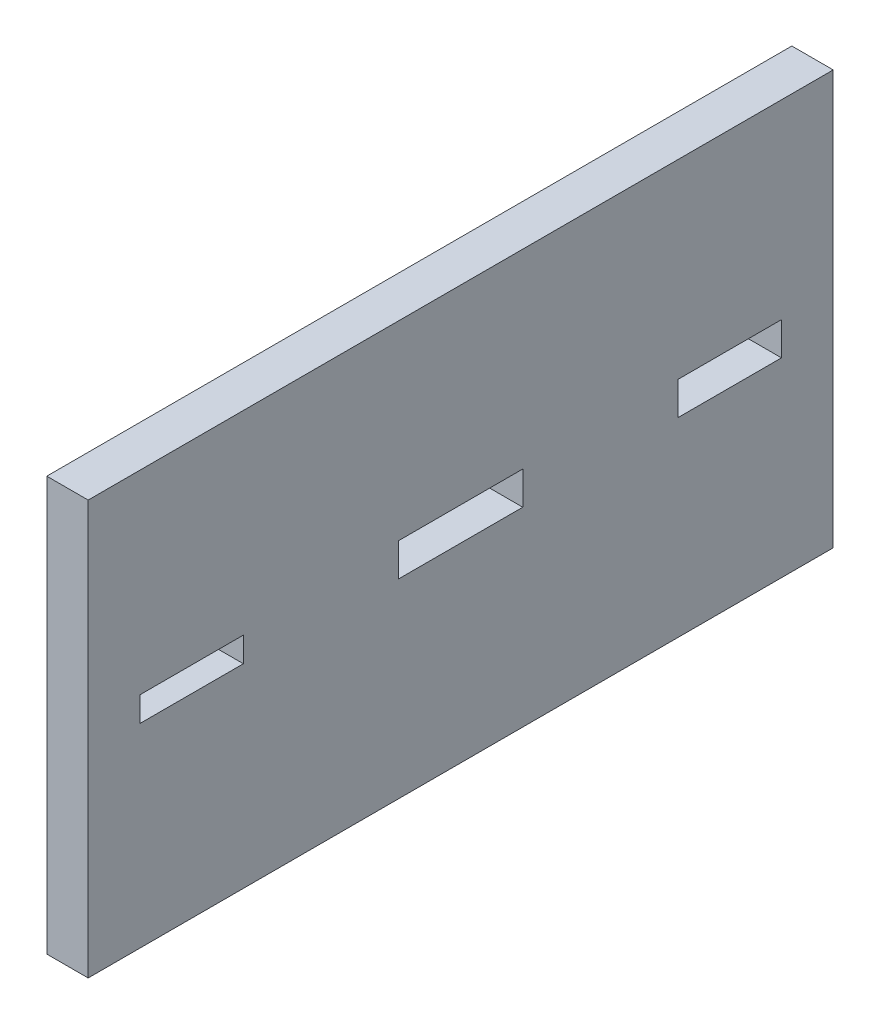
ISO-10303-21;
HEADER;
FILE_DESCRIPTION(('STEP AP214'),'2;1');
FILE_NAME('part.step','',(''),(''),'','','');
FILE_SCHEMA(('AUTOMOTIVE_DESIGN { 1 0 10303 214 1 1 1 1 }'));
ENDSEC;
DATA;
#1=APPLICATION_CONTEXT('core data for automotive mechanical design processes');
#2=APPLICATION_PROTOCOL_DEFINITION('international standard','automotive_design',2000,#1);
#3=PRODUCT_CONTEXT('',#1,'mechanical');
#4=PRODUCT('Part','Part','',(#3));
#5=PRODUCT_RELATED_PRODUCT_CATEGORY('part','',(#4));
#6=PRODUCT_DEFINITION_FORMATION('','',#4);
#7=PRODUCT_DEFINITION_CONTEXT('part definition',#1,'design');
#8=PRODUCT_DEFINITION('design','',#6,#7);
#9=PRODUCT_DEFINITION_SHAPE('','',#8);
#10=(LENGTH_UNIT() NAMED_UNIT(*) SI_UNIT(.MILLI.,.METRE.));
#11=(NAMED_UNIT(*) PLANE_ANGLE_UNIT() SI_UNIT($,.RADIAN.));
#12=(NAMED_UNIT(*) SI_UNIT($,.STERADIAN.) SOLID_ANGLE_UNIT());
#13=UNCERTAINTY_MEASURE_WITH_UNIT(LENGTH_MEASURE(1.E-05),#10,'distance_accuracy_value','');
#14=(GEOMETRIC_REPRESENTATION_CONTEXT(3) GLOBAL_UNCERTAINTY_ASSIGNED_CONTEXT((#13)) GLOBAL_UNIT_ASSIGNED_CONTEXT((#10,
#11,#12)) REPRESENTATION_CONTEXT('',''));
#15=CARTESIAN_POINT('',(0.,0.,0.));
#16=DIRECTION('',(0.,0.,1.));
#17=DIRECTION('',(1.,0.,0.));
#18=AXIS2_PLACEMENT_3D('',#15,#16,#17);
#19=CARTESIAN_POINT('',(10.,0.,0.));
#20=DIRECTION('',(1.,0.,0.));
#21=DIRECTION('',(0.,0.,-1.));
#22=AXIS2_PLACEMENT_3D('',#19,#20,#21);
#23=PLANE('',#22);
#24=DIRECTION('',(0.,-1.,0.));
#25=VECTOR('',#24,1.);
#26=CARTESIAN_POINT('',(10.,50.,90.));
#27=LINE('',#26,#25);
#28=CARTESIAN_POINT('',(10.,50.,90.));
#29=VERTEX_POINT('',#28);
#30=CARTESIAN_POINT('',(10.,-50.,90.));
#31=VERTEX_POINT('',#30);
#32=EDGE_CURVE('E287',#29,#31,#27,.T.);
#33=ORIENTED_EDGE('',*,*,#32,.T.);
#34=DIRECTION('',(0.,0.,-1.));
#35=VECTOR('',#34,1.);
#36=CARTESIAN_POINT('',(10.,-50.,90.));
#37=LINE('',#36,#35);
#38=CARTESIAN_POINT('',(10.,-50.,-90.));
#39=VERTEX_POINT('',#38);
#40=EDGE_CURVE('E291',#31,#39,#37,.T.);
#41=ORIENTED_EDGE('',*,*,#40,.T.);
#42=DIRECTION('',(0.,1.,0.));
#43=VECTOR('',#42,1.);
#44=CARTESIAN_POINT('',(10.,50.,-90.));
#45=LINE('',#44,#43);
#46=CARTESIAN_POINT('',(10.,50.,-90.));
#47=VERTEX_POINT('',#46);
#48=EDGE_CURVE('E295',#39,#47,#45,.T.);
#49=ORIENTED_EDGE('',*,*,#48,.T.);
#50=DIRECTION('',(0.,0.,1.));
#51=VECTOR('',#50,1.);
#52=CARTESIAN_POINT('',(10.,50.,90.));
#53=LINE('',#52,#51);
#54=EDGE_CURVE('E298',#47,#29,#53,.T.);
#55=ORIENTED_EDGE('',*,*,#54,.T.);
#56=EDGE_LOOP('',(#33,#41,#49,#55));
#57=FACE_BOUND('',#56,.T.);
#58=DIRECTION('',(0.,0.,-1.));
#59=VECTOR('',#58,1.);
#60=CARTESIAN_POINT('',(10.,-4.,15.));
#61=LINE('',#60,#59);
#62=CARTESIAN_POINT('',(10.,-4.,15.));
#63=VERTEX_POINT('',#62);
#64=CARTESIAN_POINT('',(10.,-4.00000000000001,-15.));
#65=VERTEX_POINT('',#64);
#66=EDGE_CURVE('E247',#63,#65,#61,.T.);
#67=ORIENTED_EDGE('',*,*,#66,.F.);
#68=DIRECTION('',(0.,-1.,0.));
#69=VECTOR('',#68,1.);
#70=CARTESIAN_POINT('',(10.,4.,15.));
#71=LINE('',#70,#69);
#72=CARTESIAN_POINT('',(10.,4.,15.));
#73=VERTEX_POINT('',#72);
#74=EDGE_CURVE('E244',#73,#63,#71,.T.);
#75=ORIENTED_EDGE('',*,*,#74,.F.);
#76=DIRECTION('',(0.,0.,1.));
#77=VECTOR('',#76,1.);
#78=CARTESIAN_POINT('',(10.,4.,15.));
#79=LINE('',#78,#77);
#80=CARTESIAN_POINT('',(10.,4.00000000000001,-15.));
#81=VERTEX_POINT('',#80);
#82=EDGE_CURVE('E255',#81,#73,#79,.T.);
#83=ORIENTED_EDGE('',*,*,#82,.F.);
#84=DIRECTION('',(0.,1.,0.));
#85=VECTOR('',#84,1.);
#86=CARTESIAN_POINT('',(10.,4.00000000000001,-15.));
#87=LINE('',#86,#85);
#88=EDGE_CURVE('E251',#65,#81,#87,.T.);
#89=ORIENTED_EDGE('',*,*,#88,.F.);
#90=EDGE_LOOP('',(#67,#75,#83,#89));
#91=FACE_BOUND('',#90,.T.);
#92=DIRECTION('',(0.,0.,-1.));
#93=VECTOR('',#92,1.);
#94=CARTESIAN_POINT('',(10.,-3.00000000000001,77.5));
#95=LINE('',#94,#93);
#96=CARTESIAN_POINT('',(10.,-3.00000000000001,77.5));
#97=VERTEX_POINT('',#96);
#98=CARTESIAN_POINT('',(10.,-3.00000000000001,52.5));
#99=VERTEX_POINT('',#98);
#100=EDGE_CURVE('E204',#97,#99,#95,.T.);
#101=ORIENTED_EDGE('',*,*,#100,.F.);
#102=DIRECTION('',(0.,-1.,0.));
#103=VECTOR('',#102,1.);
#104=CARTESIAN_POINT('',(10.,2.99999999999999,77.5));
#105=LINE('',#104,#103);
#106=CARTESIAN_POINT('',(10.,2.99999999999999,77.5));
#107=VERTEX_POINT('',#106);
#108=EDGE_CURVE('E201',#107,#97,#105,.T.);
#109=ORIENTED_EDGE('',*,*,#108,.F.);
#110=DIRECTION('',(0.,0.,1.));
#111=VECTOR('',#110,1.);
#112=CARTESIAN_POINT('',(10.,2.99999999999999,77.5));
#113=LINE('',#112,#111);
#114=CARTESIAN_POINT('',(10.,2.99999999999999,52.5));
#115=VERTEX_POINT('',#114);
#116=EDGE_CURVE('E212',#115,#107,#113,.T.);
#117=ORIENTED_EDGE('',*,*,#116,.F.);
#118=DIRECTION('',(0.,1.,0.));
#119=VECTOR('',#118,1.);
#120=CARTESIAN_POINT('',(10.,2.99999999999999,52.5));
#121=LINE('',#120,#119);
#122=EDGE_CURVE('E208',#99,#115,#121,.T.);
#123=ORIENTED_EDGE('',*,*,#122,.F.);
#124=EDGE_LOOP('',(#101,#109,#117,#123));
#125=FACE_BOUND('',#124,.T.);
#126=DIRECTION('',(0.,0.,-1.));
#127=VECTOR('',#126,1.);
#128=CARTESIAN_POINT('',(10.,-3.99999999999999,-52.5));
#129=LINE('',#128,#127);
#130=CARTESIAN_POINT('',(10.,-3.99999999999999,-52.5));
#131=VERTEX_POINT('',#130);
#132=CARTESIAN_POINT('',(10.,-4.,-77.5));
#133=VERTEX_POINT('',#132);
#134=EDGE_CURVE('E162',#131,#133,#129,.T.);
#135=ORIENTED_EDGE('',*,*,#134,.F.);
#136=DIRECTION('',(0.,-1.,0.));
#137=VECTOR('',#136,1.);
#138=CARTESIAN_POINT('',(10.,3.99999999999999,-52.5));
#139=LINE('',#138,#137);
#140=CARTESIAN_POINT('',(10.,3.99999999999999,-52.5));
#141=VERTEX_POINT('',#140);
#142=EDGE_CURVE('E153',#141,#131,#139,.T.);
#143=ORIENTED_EDGE('',*,*,#142,.F.);
#144=DIRECTION('',(0.,0.,1.));
#145=VECTOR('',#144,1.);
#146=CARTESIAN_POINT('',(10.,3.99999999999999,-52.5));
#147=LINE('',#146,#145);
#148=CARTESIAN_POINT('',(10.,4.,-77.5));
#149=VERTEX_POINT('',#148);
#150=EDGE_CURVE('E179',#149,#141,#147,.T.);
#151=ORIENTED_EDGE('',*,*,#150,.F.);
#152=DIRECTION('',(0.,1.,0.));
#153=VECTOR('',#152,1.);
#154=CARTESIAN_POINT('',(10.,4.,-77.5));
#155=LINE('',#154,#153);
#156=EDGE_CURVE('E175',#133,#149,#155,.T.);
#157=ORIENTED_EDGE('',*,*,#156,.F.);
#158=EDGE_LOOP('',(#135,#143,#151,#157));
#159=FACE_BOUND('',#158,.T.);
#160=ADVANCED_FACE('F39',(#57,#91,#125,#159),#23,.T.);
#161=CARTESIAN_POINT('',(0.,0.,0.));
#162=DIRECTION('',(1.,0.,0.));
#163=DIRECTION('',(0.,0.,-1.));
#164=AXIS2_PLACEMENT_3D('',#161,#162,#163);
#165=PLANE('',#164);
#166=DIRECTION('',(0.,-1.,0.));
#167=VECTOR('',#166,1.);
#168=CARTESIAN_POINT('',(0.,2.99999999999999,77.5));
#169=LINE('',#168,#167);
#170=CARTESIAN_POINT('',(0.,2.99999999999999,77.5));
#171=VERTEX_POINT('',#170);
#172=CARTESIAN_POINT('',(0.,-3.00000000000001,77.5));
#173=VERTEX_POINT('',#172);
#174=EDGE_CURVE('E171',#171,#173,#169,.T.);
#175=ORIENTED_EDGE('',*,*,#174,.T.);
#176=DIRECTION('',(0.,0.,-1.));
#177=VECTOR('',#176,1.);
#178=CARTESIAN_POINT('',(0.,-3.00000000000001,77.5));
#179=LINE('',#178,#177);
#180=CARTESIAN_POINT('',(0.,-3.00000000000001,52.5));
#181=VERTEX_POINT('',#180);
#182=EDGE_CURVE('E219',#173,#181,#179,.T.);
#183=ORIENTED_EDGE('',*,*,#182,.T.);
#184=DIRECTION('',(0.,1.,0.));
#185=VECTOR('',#184,1.);
#186=CARTESIAN_POINT('',(0.,2.99999999999999,52.5));
#187=LINE('',#186,#185);
#188=CARTESIAN_POINT('',(0.,2.99999999999999,52.5));
#189=VERTEX_POINT('',#188);
#190=EDGE_CURVE('E223',#181,#189,#187,.T.);
#191=ORIENTED_EDGE('',*,*,#190,.T.);
#192=DIRECTION('',(0.,0.,1.));
#193=VECTOR('',#192,1.);
#194=CARTESIAN_POINT('',(0.,2.99999999999999,77.5));
#195=LINE('',#194,#193);
#196=EDGE_CURVE('E205',#189,#171,#195,.T.);
#197=ORIENTED_EDGE('',*,*,#196,.T.);
#198=EDGE_LOOP('',(#175,#183,#191,#197));
#199=FACE_BOUND('',#198,.T.);
#200=DIRECTION('',(0.,-1.,0.));
#201=VECTOR('',#200,1.);
#202=CARTESIAN_POINT('',(0.,50.,90.));
#203=LINE('',#202,#201);
#204=CARTESIAN_POINT('',(0.,50.,90.));
#205=VERTEX_POINT('',#204);
#206=CARTESIAN_POINT('',(0.,-50.,90.));
#207=VERTEX_POINT('',#206);
#208=EDGE_CURVE('E286',#205,#207,#203,.T.);
#209=ORIENTED_EDGE('',*,*,#208,.F.);
#210=DIRECTION('',(0.,0.,1.));
#211=VECTOR('',#210,1.);
#212=CARTESIAN_POINT('',(0.,50.,90.));
#213=LINE('',#212,#211);
#214=CARTESIAN_POINT('',(0.,50.,-90.));
#215=VERTEX_POINT('',#214);
#216=EDGE_CURVE('E292',#215,#205,#213,.T.);
#217=ORIENTED_EDGE('',*,*,#216,.F.);
#218=DIRECTION('',(0.,1.,0.));
#219=VECTOR('',#218,1.);
#220=CARTESIAN_POINT('',(0.,50.,-90.));
#221=LINE('',#220,#219);
#222=CARTESIAN_POINT('',(0.,-50.,-90.));
#223=VERTEX_POINT('',#222);
#224=EDGE_CURVE('E308',#223,#215,#221,.T.);
#225=ORIENTED_EDGE('',*,*,#224,.F.);
#226=DIRECTION('',(0.,0.,-1.));
#227=VECTOR('',#226,1.);
#228=CARTESIAN_POINT('',(0.,-50.,90.));
#229=LINE('',#228,#227);
#230=EDGE_CURVE('E305',#207,#223,#229,.T.);
#231=ORIENTED_EDGE('',*,*,#230,.F.);
#232=EDGE_LOOP('',(#209,#217,#225,#231));
#233=FACE_BOUND('',#232,.T.);
#234=DIRECTION('',(0.,-1.,0.));
#235=VECTOR('',#234,1.);
#236=CARTESIAN_POINT('',(0.,4.,15.));
#237=LINE('',#236,#235);
#238=CARTESIAN_POINT('',(0.,4.,15.));
#239=VERTEX_POINT('',#238);
#240=CARTESIAN_POINT('',(0.,-4.,15.));
#241=VERTEX_POINT('',#240);
#242=EDGE_CURVE('E243',#239,#241,#237,.T.);
#243=ORIENTED_EDGE('',*,*,#242,.T.);
#244=DIRECTION('',(0.,0.,-1.));
#245=VECTOR('',#244,1.);
#246=CARTESIAN_POINT('',(0.,-4.,15.));
#247=LINE('',#246,#245);
#248=CARTESIAN_POINT('',(0.,-4.00000000000001,-15.));
#249=VERTEX_POINT('',#248);
#250=EDGE_CURVE('E262',#241,#249,#247,.T.);
#251=ORIENTED_EDGE('',*,*,#250,.T.);
#252=DIRECTION('',(0.,1.,0.));
#253=VECTOR('',#252,1.);
#254=CARTESIAN_POINT('',(0.,4.00000000000001,-15.));
#255=LINE('',#254,#253);
#256=CARTESIAN_POINT('',(0.,4.00000000000001,-15.));
#257=VERTEX_POINT('',#256);
#258=EDGE_CURVE('E266',#249,#257,#255,.T.);
#259=ORIENTED_EDGE('',*,*,#258,.T.);
#260=DIRECTION('',(0.,0.,1.));
#261=VECTOR('',#260,1.);
#262=CARTESIAN_POINT('',(0.,4.,15.));
#263=LINE('',#262,#261);
#264=EDGE_CURVE('E248',#257,#239,#263,.T.);
#265=ORIENTED_EDGE('',*,*,#264,.T.);
#266=EDGE_LOOP('',(#243,#251,#259,#265));
#267=FACE_BOUND('',#266,.T.);
#268=DIRECTION('',(0.,-1.,0.));
#269=VECTOR('',#268,1.);
#270=CARTESIAN_POINT('',(0.,3.99999999999999,-52.5));
#271=LINE('',#270,#269);
#272=CARTESIAN_POINT('',(0.,3.99999999999999,-52.5));
#273=VERTEX_POINT('',#272);
#274=CARTESIAN_POINT('',(0.,-3.99999999999999,-52.5));
#275=VERTEX_POINT('',#274);
#276=EDGE_CURVE('E63',#273,#275,#271,.T.);
#277=ORIENTED_EDGE('',*,*,#276,.T.);
#278=DIRECTION('',(0.,0.,-1.));
#279=VECTOR('',#278,1.);
#280=CARTESIAN_POINT('',(0.,-3.99999999999999,-52.5));
#281=LINE('',#280,#279);
#282=CARTESIAN_POINT('',(0.,-4.,-77.5));
#283=VERTEX_POINT('',#282);
#284=EDGE_CURVE('E169',#275,#283,#281,.T.);
#285=ORIENTED_EDGE('',*,*,#284,.T.);
#286=DIRECTION('',(0.,1.,0.));
#287=VECTOR('',#286,1.);
#288=CARTESIAN_POINT('',(0.,4.,-77.5));
#289=LINE('',#288,#287);
#290=CARTESIAN_POINT('',(0.,4.,-77.5));
#291=VERTEX_POINT('',#290);
#292=EDGE_CURVE('E188',#283,#291,#289,.T.);
#293=ORIENTED_EDGE('',*,*,#292,.T.);
#294=DIRECTION('',(0.,0.,1.));
#295=VECTOR('',#294,1.);
#296=CARTESIAN_POINT('',(0.,3.99999999999999,-52.5));
#297=LINE('',#296,#295);
#298=EDGE_CURVE('E163',#291,#273,#297,.T.);
#299=ORIENTED_EDGE('',*,*,#298,.T.);
#300=EDGE_LOOP('',(#277,#285,#293,#299));
#301=FACE_BOUND('',#300,.T.);
#302=ADVANCED_FACE('F331',(#199,#233,#267,#301),#165,.F.);
#303=CARTESIAN_POINT('',(10.,50.,90.));
#304=DIRECTION('',(0.,0.,-1.));
#305=DIRECTION('',(-1.,0.,0.));
#306=AXIS2_PLACEMENT_3D('',#303,#304,#305);
#307=PLANE('',#306);
#308=ORIENTED_EDGE('',*,*,#208,.T.);
#309=DIRECTION('',(-1.,0.,0.));
#310=VECTOR('',#309,1.);
#311=CARTESIAN_POINT('',(10.,-50.,90.));
#312=LINE('',#311,#310);
#313=EDGE_CURVE('E11',#31,#207,#312,.T.);
#314=ORIENTED_EDGE('',*,*,#313,.F.);
#315=ORIENTED_EDGE('',*,*,#32,.F.);
#316=DIRECTION('',(-1.,0.,0.));
#317=VECTOR('',#316,1.);
#318=CARTESIAN_POINT('',(10.,50.,90.));
#319=LINE('',#318,#317);
#320=EDGE_CURVE('E301',#29,#205,#319,.T.);
#321=ORIENTED_EDGE('',*,*,#320,.T.);
#322=EDGE_LOOP('',(#308,#314,#315,#321));
#323=FACE_BOUND('',#322,.T.);
#324=ADVANCED_FACE('F41',(#323),#307,.F.);
#325=CARTESIAN_POINT('',(10.,-50.,90.));
#326=DIRECTION('',(0.,1.,0.));
#327=DIRECTION('',(0.,0.,1.));
#328=AXIS2_PLACEMENT_3D('',#325,#326,#327);
#329=PLANE('',#328);
#330=ORIENTED_EDGE('',*,*,#230,.T.);
#331=DIRECTION('',(-1.,0.,0.));
#332=VECTOR('',#331,1.);
#333=CARTESIAN_POINT('',(10.,-50.,-90.));
#334=LINE('',#333,#332);
#335=EDGE_CURVE('E48',#39,#223,#334,.T.);
#336=ORIENTED_EDGE('',*,*,#335,.F.);
#337=ORIENTED_EDGE('',*,*,#40,.F.);
#338=ORIENTED_EDGE('',*,*,#313,.T.);
#339=EDGE_LOOP('',(#330,#336,#337,#338));
#340=FACE_BOUND('',#339,.T.);
#341=ADVANCED_FACE('F342',(#340),#329,.F.);
#342=CARTESIAN_POINT('',(10.,50.,-90.));
#343=DIRECTION('',(0.,0.,1.));
#344=DIRECTION('',(1.,0.,0.));
#345=AXIS2_PLACEMENT_3D('',#342,#343,#344);
#346=PLANE('',#345);
#347=ORIENTED_EDGE('',*,*,#224,.T.);
#348=DIRECTION('',(-1.,0.,0.));
#349=VECTOR('',#348,1.);
#350=CARTESIAN_POINT('',(10.,50.,-90.));
#351=LINE('',#350,#349);
#352=EDGE_CURVE('E316',#47,#215,#351,.T.);
#353=ORIENTED_EDGE('',*,*,#352,.F.);
#354=ORIENTED_EDGE('',*,*,#48,.F.);
#355=ORIENTED_EDGE('',*,*,#335,.T.);
#356=EDGE_LOOP('',(#347,#353,#354,#355));
#357=FACE_BOUND('',#356,.T.);
#358=ADVANCED_FACE('F325',(#357),#346,.F.);
#359=CARTESIAN_POINT('',(10.,50.,90.));
#360=DIRECTION('',(0.,-1.,0.));
#361=DIRECTION('',(0.,0.,-1.));
#362=AXIS2_PLACEMENT_3D('',#359,#360,#361);
#363=PLANE('',#362);
#364=ORIENTED_EDGE('',*,*,#216,.T.);
#365=ORIENTED_EDGE('',*,*,#320,.F.);
#366=ORIENTED_EDGE('',*,*,#54,.F.);
#367=ORIENTED_EDGE('',*,*,#352,.T.);
#368=EDGE_LOOP('',(#364,#365,#366,#367));
#369=FACE_BOUND('',#368,.T.);
#370=ADVANCED_FACE('F335',(#369),#363,.F.);
#371=CARTESIAN_POINT('',(10.,4.,15.));
#372=DIRECTION('',(0.,0.,-1.));
#373=DIRECTION('',(-1.,0.,0.));
#374=AXIS2_PLACEMENT_3D('',#371,#372,#373);
#375=PLANE('',#374);
#376=ORIENTED_EDGE('',*,*,#242,.F.);
#377=DIRECTION('',(-1.,0.,0.));
#378=VECTOR('',#377,1.);
#379=CARTESIAN_POINT('',(10.,4.,15.));
#380=LINE('',#379,#378);
#381=EDGE_CURVE('E258',#73,#239,#380,.T.);
#382=ORIENTED_EDGE('',*,*,#381,.F.);
#383=ORIENTED_EDGE('',*,*,#74,.T.);
#384=DIRECTION('',(-1.,0.,0.));
#385=VECTOR('',#384,1.);
#386=CARTESIAN_POINT('',(10.,-4.,15.));
#387=LINE('',#386,#385);
#388=EDGE_CURVE('E282',#63,#241,#387,.T.);
#389=ORIENTED_EDGE('',*,*,#388,.T.);
#390=EDGE_LOOP('',(#376,#382,#383,#389));
#391=FACE_BOUND('',#390,.T.);
#392=ADVANCED_FACE('F357',(#391),#375,.T.);
#393=CARTESIAN_POINT('',(10.,-4.,15.));
#394=DIRECTION('',(0.,1.,0.));
#395=DIRECTION('',(0.,0.,1.));
#396=AXIS2_PLACEMENT_3D('',#393,#394,#395);
#397=PLANE('',#396);
#398=ORIENTED_EDGE('',*,*,#250,.F.);
#399=ORIENTED_EDGE('',*,*,#388,.F.);
#400=ORIENTED_EDGE('',*,*,#66,.T.);
#401=DIRECTION('',(-1.,0.,0.));
#402=VECTOR('',#401,1.);
#403=CARTESIAN_POINT('',(10.,-4.00000000000001,-15.));
#404=LINE('',#403,#402);
#405=EDGE_CURVE('E279',#65,#249,#404,.T.);
#406=ORIENTED_EDGE('',*,*,#405,.T.);
#407=EDGE_LOOP('',(#398,#399,#400,#406));
#408=FACE_BOUND('',#407,.T.);
#409=ADVANCED_FACE('F364',(#408),#397,.T.);
#410=CARTESIAN_POINT('',(10.,4.00000000000001,-15.));
#411=DIRECTION('',(0.,0.,1.));
#412=DIRECTION('',(1.,0.,0.));
#413=AXIS2_PLACEMENT_3D('',#410,#411,#412);
#414=PLANE('',#413);
#415=ORIENTED_EDGE('',*,*,#258,.F.);
#416=ORIENTED_EDGE('',*,*,#405,.F.);
#417=ORIENTED_EDGE('',*,*,#88,.T.);
#418=DIRECTION('',(-1.,0.,0.));
#419=VECTOR('',#418,1.);
#420=CARTESIAN_POINT('',(10.,4.00000000000001,-15.));
#421=LINE('',#420,#419);
#422=EDGE_CURVE('E276',#81,#257,#421,.T.);
#423=ORIENTED_EDGE('',*,*,#422,.T.);
#424=EDGE_LOOP('',(#415,#416,#417,#423));
#425=FACE_BOUND('',#424,.T.);
#426=ADVANCED_FACE('F369',(#425),#414,.T.);
#427=CARTESIAN_POINT('',(10.,4.,15.));
#428=DIRECTION('',(0.,-1.,0.));
#429=DIRECTION('',(0.,0.,-1.));
#430=AXIS2_PLACEMENT_3D('',#427,#428,#429);
#431=PLANE('',#430);
#432=ORIENTED_EDGE('',*,*,#264,.F.);
#433=ORIENTED_EDGE('',*,*,#422,.F.);
#434=ORIENTED_EDGE('',*,*,#82,.T.);
#435=ORIENTED_EDGE('',*,*,#381,.T.);
#436=EDGE_LOOP('',(#432,#433,#434,#435));
#437=FACE_BOUND('',#436,.T.);
#438=ADVANCED_FACE('F376',(#437),#431,.T.);
#439=CARTESIAN_POINT('',(10.,2.99999999999999,77.5));
#440=DIRECTION('',(0.,0.,-1.));
#441=DIRECTION('',(-1.,0.,0.));
#442=AXIS2_PLACEMENT_3D('',#439,#440,#441);
#443=PLANE('',#442);
#444=ORIENTED_EDGE('',*,*,#174,.F.);
#445=DIRECTION('',(-1.,0.,0.));
#446=VECTOR('',#445,1.);
#447=CARTESIAN_POINT('',(10.,2.99999999999999,77.5));
#448=LINE('',#447,#446);
#449=EDGE_CURVE('E215',#107,#171,#448,.T.);
#450=ORIENTED_EDGE('',*,*,#449,.F.);
#451=ORIENTED_EDGE('',*,*,#108,.T.);
#452=DIRECTION('',(-1.,0.,0.));
#453=VECTOR('',#452,1.);
#454=CARTESIAN_POINT('',(10.,-3.00000000000001,77.5));
#455=LINE('',#454,#453);
#456=EDGE_CURVE('E239',#97,#173,#455,.T.);
#457=ORIENTED_EDGE('',*,*,#456,.T.);
#458=EDGE_LOOP('',(#444,#450,#451,#457));
#459=FACE_BOUND('',#458,.T.);
#460=ADVANCED_FACE('F398',(#459),#443,.T.);
#461=CARTESIAN_POINT('',(10.,-3.00000000000001,77.5));
#462=DIRECTION('',(0.,1.,0.));
#463=DIRECTION('',(0.,0.,1.));
#464=AXIS2_PLACEMENT_3D('',#461,#462,#463);
#465=PLANE('',#464);
#466=ORIENTED_EDGE('',*,*,#182,.F.);
#467=ORIENTED_EDGE('',*,*,#456,.F.);
#468=ORIENTED_EDGE('',*,*,#100,.T.);
#469=DIRECTION('',(-1.,0.,0.));
#470=VECTOR('',#469,1.);
#471=CARTESIAN_POINT('',(10.,-3.00000000000001,52.5));
#472=LINE('',#471,#470);
#473=EDGE_CURVE('E236',#99,#181,#472,.T.);
#474=ORIENTED_EDGE('',*,*,#473,.T.);
#475=EDGE_LOOP('',(#466,#467,#468,#474));
#476=FACE_BOUND('',#475,.T.);
#477=ADVANCED_FACE('F392',(#476),#465,.T.);
#478=CARTESIAN_POINT('',(10.,2.99999999999999,52.5));
#479=DIRECTION('',(0.,0.,1.));
#480=DIRECTION('',(1.,0.,0.));
#481=AXIS2_PLACEMENT_3D('',#478,#479,#480);
#482=PLANE('',#481);
#483=ORIENTED_EDGE('',*,*,#190,.F.);
#484=ORIENTED_EDGE('',*,*,#473,.F.);
#485=ORIENTED_EDGE('',*,*,#122,.T.);
#486=DIRECTION('',(-1.,0.,0.));
#487=VECTOR('',#486,1.);
#488=CARTESIAN_POINT('',(10.,2.99999999999999,52.5));
#489=LINE('',#488,#487);
#490=EDGE_CURVE('E233',#115,#189,#489,.T.);
#491=ORIENTED_EDGE('',*,*,#490,.T.);
#492=EDGE_LOOP('',(#483,#484,#485,#491));
#493=FACE_BOUND('',#492,.T.);
#494=ADVANCED_FACE('F395',(#493),#482,.T.);
#495=CARTESIAN_POINT('',(10.,2.99999999999999,77.5));
#496=DIRECTION('',(0.,-1.,0.));
#497=DIRECTION('',(0.,0.,-1.));
#498=AXIS2_PLACEMENT_3D('',#495,#496,#497);
#499=PLANE('',#498);
#500=ORIENTED_EDGE('',*,*,#196,.F.);
#501=ORIENTED_EDGE('',*,*,#490,.F.);
#502=ORIENTED_EDGE('',*,*,#116,.T.);
#503=ORIENTED_EDGE('',*,*,#449,.T.);
#504=EDGE_LOOP('',(#500,#501,#502,#503));
#505=FACE_BOUND('',#504,.T.);
#506=ADVANCED_FACE('F401',(#505),#499,.T.);
#507=CARTESIAN_POINT('',(10.,3.99999999999999,-52.5));
#508=DIRECTION('',(0.,0.,-1.));
#509=DIRECTION('',(-1.,0.,0.));
#510=AXIS2_PLACEMENT_3D('',#507,#508,#509);
#511=PLANE('',#510);
#512=ORIENTED_EDGE('',*,*,#276,.F.);
#513=DIRECTION('',(-1.,0.,0.));
#514=VECTOR('',#513,1.);
#515=CARTESIAN_POINT('',(10.,3.99999999999999,-52.5));
#516=LINE('',#515,#514);
#517=EDGE_CURVE('E157',#141,#273,#516,.T.);
#518=ORIENTED_EDGE('',*,*,#517,.F.);
#519=ORIENTED_EDGE('',*,*,#142,.T.);
#520=DIRECTION('',(-1.,0.,0.));
#521=VECTOR('',#520,1.);
#522=CARTESIAN_POINT('',(10.,-3.99999999999999,-52.5));
#523=LINE('',#522,#521);
#524=EDGE_CURVE('E156',#131,#275,#523,.T.);
#525=ORIENTED_EDGE('',*,*,#524,.T.);
#526=EDGE_LOOP('',(#512,#518,#519,#525));
#527=FACE_BOUND('',#526,.T.);
#528=ADVANCED_FACE('F155',(#527),#511,.T.);
#529=CARTESIAN_POINT('',(10.,-3.99999999999999,-52.5));
#530=DIRECTION('',(0.,1.,0.));
#531=DIRECTION('',(0.,0.,1.));
#532=AXIS2_PLACEMENT_3D('',#529,#530,#531);
#533=PLANE('',#532);
#534=ORIENTED_EDGE('',*,*,#284,.F.);
#535=ORIENTED_EDGE('',*,*,#524,.F.);
#536=ORIENTED_EDGE('',*,*,#134,.T.);
#537=DIRECTION('',(-1.,0.,0.));
#538=VECTOR('',#537,1.);
#539=CARTESIAN_POINT('',(10.,-4.,-77.5));
#540=LINE('',#539,#538);
#541=EDGE_CURVE('E172',#133,#283,#540,.T.);
#542=ORIENTED_EDGE('',*,*,#541,.T.);
#543=EDGE_LOOP('',(#534,#535,#536,#542));
#544=FACE_BOUND('',#543,.T.);
#545=ADVANCED_FACE('F166',(#544),#533,.T.);
#546=CARTESIAN_POINT('',(10.,4.,-77.5));
#547=DIRECTION('',(0.,0.,1.));
#548=DIRECTION('',(1.,0.,0.));
#549=AXIS2_PLACEMENT_3D('',#546,#547,#548);
#550=PLANE('',#549);
#551=ORIENTED_EDGE('',*,*,#292,.F.);
#552=ORIENTED_EDGE('',*,*,#541,.F.);
#553=ORIENTED_EDGE('',*,*,#156,.T.);
#554=DIRECTION('',(-1.,0.,0.));
#555=VECTOR('',#554,1.);
#556=CARTESIAN_POINT('',(10.,4.,-77.5));
#557=LINE('',#556,#555);
#558=EDGE_CURVE('E55',#149,#291,#557,.T.);
#559=ORIENTED_EDGE('',*,*,#558,.T.);
#560=EDGE_LOOP('',(#551,#552,#553,#559));
#561=FACE_BOUND('',#560,.T.);
#562=ADVANCED_FACE('F458',(#561),#550,.T.);
#563=CARTESIAN_POINT('',(10.,3.99999999999999,-52.5));
#564=DIRECTION('',(0.,-1.,0.));
#565=DIRECTION('',(0.,0.,-1.));
#566=AXIS2_PLACEMENT_3D('',#563,#564,#565);
#567=PLANE('',#566);
#568=ORIENTED_EDGE('',*,*,#298,.F.);
#569=ORIENTED_EDGE('',*,*,#558,.F.);
#570=ORIENTED_EDGE('',*,*,#150,.T.);
#571=ORIENTED_EDGE('',*,*,#517,.T.);
#572=EDGE_LOOP('',(#568,#569,#570,#571));
#573=FACE_BOUND('',#572,.T.);
#574=ADVANCED_FACE('F466',(#573),#567,.T.);
#575=CLOSED_SHELL('',(#160,#302,#324,#341,#358,#370,#392,#409,#426,#438,#460,#477,#494,#506,
#528,#545,#562,#574));
#576=MANIFOLD_SOLID_BREP('B2',#575);
#577=ADVANCED_BREP_SHAPE_REPRESENTATION('',(#18,#576),#14);
#578=SHAPE_DEFINITION_REPRESENTATION(#9,#577);
ENDSEC;
END-ISO-10303-21;
